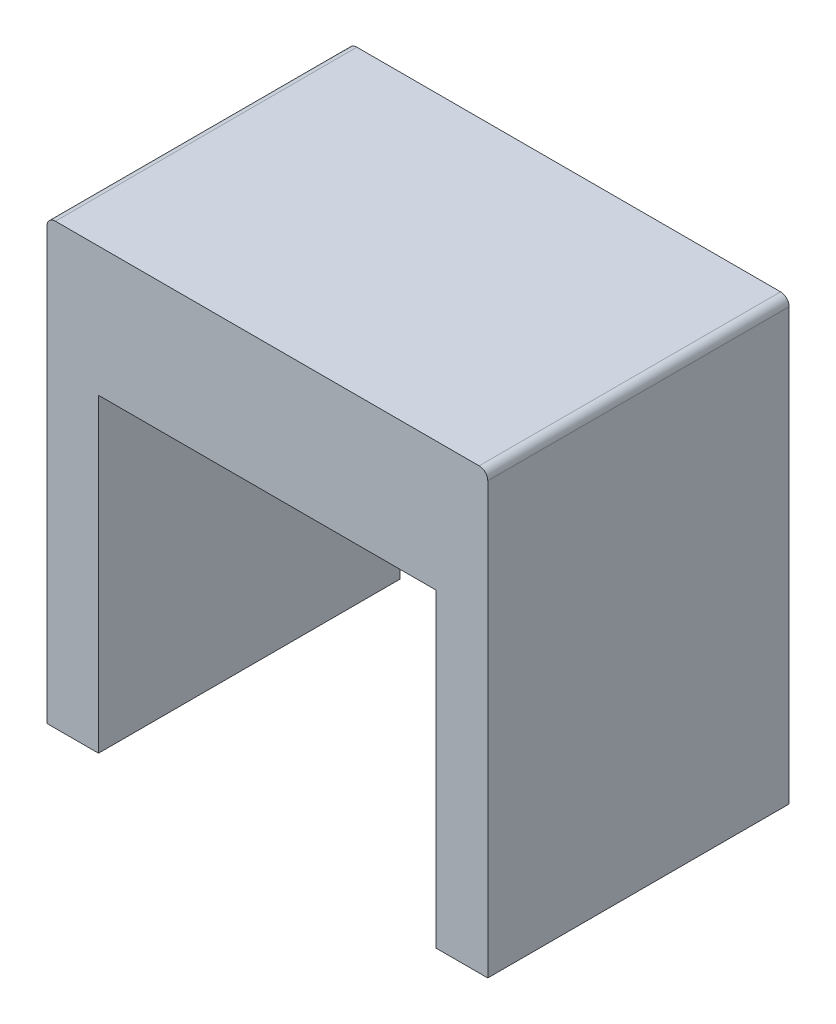
ISO-10303-21;
HEADER;
FILE_DESCRIPTION(('STEP AP214'),'2;1');
FILE_NAME('part.step','',(''),(''),'','','');
FILE_SCHEMA(('AUTOMOTIVE_DESIGN { 1 0 10303 214 1 1 1 1 }'));
ENDSEC;
DATA;
#1=APPLICATION_CONTEXT('core data for automotive mechanical design processes');
#2=APPLICATION_PROTOCOL_DEFINITION('international standard','automotive_design',2000,#1);
#3=PRODUCT_CONTEXT('',#1,'mechanical');
#4=PRODUCT('Part','Part','',(#3));
#5=PRODUCT_RELATED_PRODUCT_CATEGORY('part','',(#4));
#6=PRODUCT_DEFINITION_FORMATION('','',#4);
#7=PRODUCT_DEFINITION_CONTEXT('part definition',#1,'design');
#8=PRODUCT_DEFINITION('design','',#6,#7);
#9=PRODUCT_DEFINITION_SHAPE('','',#8);
#10=(LENGTH_UNIT() NAMED_UNIT(*) SI_UNIT(.MILLI.,.METRE.));
#11=(NAMED_UNIT(*) PLANE_ANGLE_UNIT() SI_UNIT($,.RADIAN.));
#12=(NAMED_UNIT(*) SI_UNIT($,.STERADIAN.) SOLID_ANGLE_UNIT());
#13=UNCERTAINTY_MEASURE_WITH_UNIT(LENGTH_MEASURE(1.E-05),#10,'distance_accuracy_value','');
#14=(GEOMETRIC_REPRESENTATION_CONTEXT(3) GLOBAL_UNCERTAINTY_ASSIGNED_CONTEXT((#13)) GLOBAL_UNIT_ASSIGNED_CONTEXT((#10,
#11,#12)) REPRESENTATION_CONTEXT('',''));
#15=CARTESIAN_POINT('',(0.,0.,0.));
#16=DIRECTION('',(0.,0.,1.));
#17=DIRECTION('',(1.,0.,0.));
#18=AXIS2_PLACEMENT_3D('',#15,#16,#17);
#19=CARTESIAN_POINT('',(-31.340782122905,-40.8812849162013,35.));
#20=DIRECTION('',(0.,1.,0.));
#21=DIRECTION('',(0.,0.,1.));
#22=AXIS2_PLACEMENT_3D('',#19,#20,#21);
#23=PLANE('',#22);
#24=DIRECTION('',(1.,0.,0.));
#25=VECTOR('',#24,1.);
#26=CARTESIAN_POINT('',(-31.340782122905,-40.8812849162013,0.));
#27=LINE('',#26,#25);
#28=CARTESIAN_POINT('',(-31.340782122905,-40.8812849162013,0.));
#29=VERTEX_POINT('',#28);
#30=CARTESIAN_POINT('',(-25.340782122905,-40.8812849162013,0.));
#31=VERTEX_POINT('',#30);
#32=EDGE_CURVE('E134',#29,#31,#27,.T.);
#33=ORIENTED_EDGE('',*,*,#32,.T.);
#34=DIRECTION('',(0.,0.,-1.));
#35=VECTOR('',#34,1.);
#36=CARTESIAN_POINT('',(-25.340782122905,-40.8812849162013,35.));
#37=LINE('',#36,#35);
#38=CARTESIAN_POINT('',(-25.340782122905,-40.8812849162013,35.));
#39=VERTEX_POINT('',#38);
#40=EDGE_CURVE('E117',#39,#31,#37,.T.);
#41=ORIENTED_EDGE('',*,*,#40,.F.);
#42=DIRECTION('',(1.,0.,0.));
#43=VECTOR('',#42,1.);
#44=CARTESIAN_POINT('',(-31.340782122905,-40.8812849162013,35.));
#45=LINE('',#44,#43);
#46=CARTESIAN_POINT('',(-31.340782122905,-40.8812849162013,35.));
#47=VERTEX_POINT('',#46);
#48=EDGE_CURVE('E123',#47,#39,#45,.T.);
#49=ORIENTED_EDGE('',*,*,#48,.F.);
#50=DIRECTION('',(0.,0.,-1.));
#51=VECTOR('',#50,1.);
#52=CARTESIAN_POINT('',(-31.340782122905,-40.8812849162013,35.));
#53=LINE('',#52,#51);
#54=EDGE_CURVE('E181',#47,#29,#53,.T.);
#55=ORIENTED_EDGE('',*,*,#54,.T.);
#56=EDGE_LOOP('',(#33,#41,#49,#55));
#57=FACE_BOUND('',#56,.T.);
#58=ADVANCED_FACE('F33',(#57),#23,.F.);
#59=CARTESIAN_POINT('',(-25.340782122905,-40.8812849162013,35.));
#60=DIRECTION('',(-1.,0.,0.));
#61=DIRECTION('',(0.,0.,1.));
#62=AXIS2_PLACEMENT_3D('',#59,#60,#61);
#63=PLANE('',#62);
#64=DIRECTION('',(0.,1.,0.));
#65=VECTOR('',#64,1.);
#66=CARTESIAN_POINT('',(-25.340782122905,-40.8812849162013,0.));
#67=LINE('',#66,#65);
#68=CARTESIAN_POINT('',(-25.340782122905,-4.8812849162013,0.));
#69=VERTEX_POINT('',#68);
#70=EDGE_CURVE('E197',#31,#69,#67,.T.);
#71=ORIENTED_EDGE('',*,*,#70,.T.);
#72=DIRECTION('',(0.,0.,-1.));
#73=VECTOR('',#72,1.);
#74=CARTESIAN_POINT('',(-25.340782122905,-4.8812849162013,35.));
#75=LINE('',#74,#73);
#76=CARTESIAN_POINT('',(-25.340782122905,-4.8812849162013,35.));
#77=VERTEX_POINT('',#76);
#78=EDGE_CURVE('E120',#77,#69,#75,.T.);
#79=ORIENTED_EDGE('',*,*,#78,.F.);
#80=DIRECTION('',(0.,1.,0.));
#81=VECTOR('',#80,1.);
#82=CARTESIAN_POINT('',(-25.340782122905,-40.8812849162013,35.));
#83=LINE('',#82,#81);
#84=EDGE_CURVE('E113',#39,#77,#83,.T.);
#85=ORIENTED_EDGE('',*,*,#84,.F.);
#86=ORIENTED_EDGE('',*,*,#40,.T.);
#87=EDGE_LOOP('',(#71,#79,#85,#86));
#88=FACE_BOUND('',#87,.T.);
#89=ADVANCED_FACE('F115',(#88),#63,.F.);
#90=CARTESIAN_POINT('',(-25.340782122905,-4.8812849162013,35.));
#91=DIRECTION('',(0.,1.,0.));
#92=DIRECTION('',(0.,0.,1.));
#93=AXIS2_PLACEMENT_3D('',#90,#91,#92);
#94=PLANE('',#93);
#95=DIRECTION('',(1.,0.,0.));
#96=VECTOR('',#95,1.);
#97=CARTESIAN_POINT('',(-25.340782122905,-4.8812849162013,0.));
#98=LINE('',#97,#96);
#99=CARTESIAN_POINT('',(13.859217877095,-4.8812849162013,0.));
#100=VERTEX_POINT('',#99);
#101=EDGE_CURVE('E196',#69,#100,#98,.T.);
#102=ORIENTED_EDGE('',*,*,#101,.T.);
#103=DIRECTION('',(0.,0.,-1.));
#104=VECTOR('',#103,1.);
#105=CARTESIAN_POINT('',(13.859217877095,-4.8812849162013,35.));
#106=LINE('',#105,#104);
#107=CARTESIAN_POINT('',(13.859217877095,-4.8812849162013,35.));
#108=VERTEX_POINT('',#107);
#109=EDGE_CURVE('E139',#108,#100,#106,.T.);
#110=ORIENTED_EDGE('',*,*,#109,.F.);
#111=DIRECTION('',(1.,0.,0.));
#112=VECTOR('',#111,1.);
#113=CARTESIAN_POINT('',(-25.340782122905,-4.8812849162013,35.));
#114=LINE('',#113,#112);
#115=EDGE_CURVE('E122',#77,#108,#114,.T.);
#116=ORIENTED_EDGE('',*,*,#115,.F.);
#117=ORIENTED_EDGE('',*,*,#78,.T.);
#118=EDGE_LOOP('',(#102,#110,#116,#117));
#119=FACE_BOUND('',#118,.T.);
#120=ADVANCED_FACE('F207',(#119),#94,.F.);
#121=CARTESIAN_POINT('',(13.859217877095,-4.8812849162013,35.));
#122=DIRECTION('',(1.,0.,0.));
#123=DIRECTION('',(0.,1.,0.));
#124=AXIS2_PLACEMENT_3D('',#121,#122,#123);
#125=PLANE('',#124);
#126=DIRECTION('',(0.,-1.,0.));
#127=VECTOR('',#126,1.);
#128=CARTESIAN_POINT('',(13.859217877095,-4.8812849162013,0.));
#129=LINE('',#128,#127);
#130=CARTESIAN_POINT('',(13.859217877095,-40.8812849162013,0.));
#131=VERTEX_POINT('',#130);
#132=EDGE_CURVE('E176',#100,#131,#129,.T.);
#133=ORIENTED_EDGE('',*,*,#132,.T.);
#134=DIRECTION('',(0.,0.,-1.));
#135=VECTOR('',#134,1.);
#136=CARTESIAN_POINT('',(13.859217877095,-40.8812849162013,35.));
#137=LINE('',#136,#135);
#138=CARTESIAN_POINT('',(13.859217877095,-40.8812849162013,35.));
#139=VERTEX_POINT('',#138);
#140=EDGE_CURVE('E184',#139,#131,#137,.T.);
#141=ORIENTED_EDGE('',*,*,#140,.F.);
#142=DIRECTION('',(0.,-1.,0.));
#143=VECTOR('',#142,1.);
#144=CARTESIAN_POINT('',(13.859217877095,-4.8812849162013,35.));
#145=LINE('',#144,#143);
#146=EDGE_CURVE('E193',#108,#139,#145,.T.);
#147=ORIENTED_EDGE('',*,*,#146,.F.);
#148=ORIENTED_EDGE('',*,*,#109,.T.);
#149=EDGE_LOOP('',(#133,#141,#147,#148));
#150=FACE_BOUND('',#149,.T.);
#151=ADVANCED_FACE('F191',(#150),#125,.F.);
#152=CARTESIAN_POINT('',(13.859217877095,-40.8812849162013,35.));
#153=DIRECTION('',(0.,1.,0.));
#154=DIRECTION('',(0.,0.,1.));
#155=AXIS2_PLACEMENT_3D('',#152,#153,#154);
#156=PLANE('',#155);
#157=DIRECTION('',(1.,0.,0.));
#158=VECTOR('',#157,1.);
#159=CARTESIAN_POINT('',(13.859217877095,-40.8812849162013,0.));
#160=LINE('',#159,#158);
#161=CARTESIAN_POINT('',(19.859217877095,-40.8812849162013,0.));
#162=VERTEX_POINT('',#161);
#163=EDGE_CURVE('E173',#131,#162,#160,.T.);
#164=ORIENTED_EDGE('',*,*,#163,.T.);
#165=DIRECTION('',(0.,0.,-1.));
#166=VECTOR('',#165,1.);
#167=CARTESIAN_POINT('',(19.859217877095,-40.8812849162013,35.));
#168=LINE('',#167,#166);
#169=CARTESIAN_POINT('',(19.859217877095,-40.8812849162013,35.));
#170=VERTEX_POINT('',#169);
#171=EDGE_CURVE('E172',#170,#162,#168,.T.);
#172=ORIENTED_EDGE('',*,*,#171,.F.);
#173=DIRECTION('',(1.,0.,0.));
#174=VECTOR('',#173,1.);
#175=CARTESIAN_POINT('',(13.859217877095,-40.8812849162013,35.));
#176=LINE('',#175,#174);
#177=EDGE_CURVE('E204',#139,#170,#176,.T.);
#178=ORIENTED_EDGE('',*,*,#177,.F.);
#179=ORIENTED_EDGE('',*,*,#140,.T.);
#180=EDGE_LOOP('',(#164,#172,#178,#179));
#181=FACE_BOUND('',#180,.T.);
#182=ADVANCED_FACE('F214',(#181),#156,.F.);
#183=CARTESIAN_POINT('',(19.859217877095,-40.8812849162013,35.));
#184=DIRECTION('',(-1.,0.,0.));
#185=DIRECTION('',(0.,0.,1.));
#186=AXIS2_PLACEMENT_3D('',#183,#184,#185);
#187=PLANE('',#186);
#188=DIRECTION('',(0.,1.,0.));
#189=VECTOR('',#188,1.);
#190=CARTESIAN_POINT('',(19.859217877095,-40.8812849162013,0.));
#191=LINE('',#190,#189);
#192=CARTESIAN_POINT('',(19.859217877095,9.1187150837987,0.));
#193=VERTEX_POINT('',#192);
#194=EDGE_CURVE('E167',#162,#193,#191,.T.);
#195=ORIENTED_EDGE('',*,*,#194,.T.);
#196=DIRECTION('',(0.,0.,-1.));
#197=VECTOR('',#196,1.);
#198=CARTESIAN_POINT('',(19.859217877095,9.1187150837987,35.));
#199=LINE('',#198,#197);
#200=CARTESIAN_POINT('',(19.859217877095,9.1187150837987,35.));
#201=VERTEX_POINT('',#200);
#202=EDGE_CURVE('E56',#193,#201,#199,.F.);
#203=ORIENTED_EDGE('',*,*,#202,.T.);
#204=DIRECTION('',(0.,1.,0.));
#205=VECTOR('',#204,1.);
#206=CARTESIAN_POINT('',(19.859217877095,-40.8812849162013,35.));
#207=LINE('',#206,#205);
#208=EDGE_CURVE('E153',#170,#201,#207,.T.);
#209=ORIENTED_EDGE('',*,*,#208,.F.);
#210=ORIENTED_EDGE('',*,*,#171,.T.);
#211=EDGE_LOOP('',(#195,#203,#209,#210));
#212=FACE_BOUND('',#211,.T.);
#213=ADVANCED_FACE('F170',(#212),#187,.F.);
#214=CARTESIAN_POINT('',(19.859217877095,10.1187150837987,35.));
#215=DIRECTION('',(0.,-1.,0.));
#216=DIRECTION('',(0.,0.,-1.));
#217=AXIS2_PLACEMENT_3D('',#214,#215,#216);
#218=PLANE('',#217);
#219=DIRECTION('',(-1.,0.,0.));
#220=VECTOR('',#219,1.);
#221=CARTESIAN_POINT('',(19.859217877095,10.1187150837987,35.));
#222=LINE('',#221,#220);
#223=CARTESIAN_POINT('',(18.859217877095,10.1187150837987,35.));
#224=VERTEX_POINT('',#223);
#225=CARTESIAN_POINT('',(-30.340782122905,10.1187150837987,35.));
#226=VERTEX_POINT('',#225);
#227=EDGE_CURVE('E152',#224,#226,#222,.T.);
#228=ORIENTED_EDGE('',*,*,#227,.F.);
#229=DIRECTION('',(0.,0.,-1.));
#230=VECTOR('',#229,1.);
#231=CARTESIAN_POINT('',(18.859217877095,10.1187150837987,35.));
#232=LINE('',#231,#230);
#233=CARTESIAN_POINT('',(18.859217877095,10.1187150837987,0.));
#234=VERTEX_POINT('',#233);
#235=EDGE_CURVE('E137',#224,#234,#232,.T.);
#236=ORIENTED_EDGE('',*,*,#235,.T.);
#237=DIRECTION('',(-1.,0.,0.));
#238=VECTOR('',#237,1.);
#239=CARTESIAN_POINT('',(19.859217877095,10.1187150837987,0.));
#240=LINE('',#239,#238);
#241=CARTESIAN_POINT('',(-30.340782122905,10.1187150837987,0.));
#242=VERTEX_POINT('',#241);
#243=EDGE_CURVE('E168',#234,#242,#240,.T.);
#244=ORIENTED_EDGE('',*,*,#243,.T.);
#245=DIRECTION('',(0.,0.,-1.));
#246=VECTOR('',#245,1.);
#247=CARTESIAN_POINT('',(-30.340782122905,10.1187150837987,35.));
#248=LINE('',#247,#246);
#249=EDGE_CURVE('E135',#242,#226,#248,.F.);
#250=ORIENTED_EDGE('',*,*,#249,.T.);
#251=EDGE_LOOP('',(#228,#236,#244,#250));
#252=FACE_BOUND('',#251,.T.);
#253=ADVANCED_FACE('F157',(#252),#218,.F.);
#254=CARTESIAN_POINT('',(-31.340782122905,10.1187150837987,35.));
#255=DIRECTION('',(1.,0.,0.));
#256=DIRECTION('',(0.,0.,-1.));
#257=AXIS2_PLACEMENT_3D('',#254,#255,#256);
#258=PLANE('',#257);
#259=DIRECTION('',(0.,-1.,0.));
#260=VECTOR('',#259,1.);
#261=CARTESIAN_POINT('',(-31.340782122905,10.1187150837987,35.));
#262=LINE('',#261,#260);
#263=CARTESIAN_POINT('',(-31.340782122905,9.1187150837987,35.));
#264=VERTEX_POINT('',#263);
#265=EDGE_CURVE('E127',#264,#47,#262,.T.);
#266=ORIENTED_EDGE('',*,*,#265,.F.);
#267=DIRECTION('',(0.,0.,-1.));
#268=VECTOR('',#267,1.);
#269=CARTESIAN_POINT('',(-31.340782122905,9.1187150837987,35.));
#270=LINE('',#269,#268);
#271=CARTESIAN_POINT('',(-31.340782122905,9.1187150837987,0.));
#272=VERTEX_POINT('',#271);
#273=EDGE_CURVE('E11',#264,#272,#270,.T.);
#274=ORIENTED_EDGE('',*,*,#273,.T.);
#275=DIRECTION('',(0.,-1.,0.));
#276=VECTOR('',#275,1.);
#277=CARTESIAN_POINT('',(-31.340782122905,10.1187150837987,0.));
#278=LINE('',#277,#276);
#279=EDGE_CURVE('E131',#272,#29,#278,.T.);
#280=ORIENTED_EDGE('',*,*,#279,.T.);
#281=ORIENTED_EDGE('',*,*,#54,.F.);
#282=EDGE_LOOP('',(#266,#274,#280,#281));
#283=FACE_BOUND('',#282,.T.);
#284=ADVANCED_FACE('F231',(#283),#258,.F.);
#285=CARTESIAN_POINT('',(0.,0.,35.));
#286=DIRECTION('',(0.,0.,1.));
#287=DIRECTION('',(1.,0.,0.));
#288=AXIS2_PLACEMENT_3D('',#285,#286,#287);
#289=PLANE('',#288);
#290=ORIENTED_EDGE('',*,*,#208,.T.);
#291=CARTESIAN_POINT('',(18.859217877095,9.1187150837987,35.));
#292=DIRECTION('',(0.,0.,1.));
#293=DIRECTION('',(1.,0.,0.));
#294=AXIS2_PLACEMENT_3D('',#291,#292,#293);
#295=CIRCLE('',#294,1.);
#296=EDGE_CURVE('E41',#201,#224,#295,.T.);
#297=ORIENTED_EDGE('',*,*,#296,.T.);
#298=ORIENTED_EDGE('',*,*,#227,.T.);
#299=CARTESIAN_POINT('',(-30.340782122905,9.1187150837987,35.));
#300=DIRECTION('',(0.,0.,1.));
#301=DIRECTION('',(1.,0.,0.));
#302=AXIS2_PLACEMENT_3D('',#299,#300,#301);
#303=CIRCLE('',#302,1.);
#304=EDGE_CURVE('E48',#226,#264,#303,.T.);
#305=ORIENTED_EDGE('',*,*,#304,.T.);
#306=ORIENTED_EDGE('',*,*,#265,.T.);
#307=ORIENTED_EDGE('',*,*,#48,.T.);
#308=ORIENTED_EDGE('',*,*,#84,.T.);
#309=ORIENTED_EDGE('',*,*,#115,.T.);
#310=ORIENTED_EDGE('',*,*,#146,.T.);
#311=ORIENTED_EDGE('',*,*,#177,.T.);
#312=EDGE_LOOP('',(#290,#297,#298,#305,#306,#307,#308,#309,#310,#311));
#313=FACE_BOUND('',#312,.T.);
#314=ADVANCED_FACE('F126',(#313),#289,.T.);
#315=CARTESIAN_POINT('',(0.,0.,0.));
#316=DIRECTION('',(0.,0.,1.));
#317=DIRECTION('',(1.,0.,0.));
#318=AXIS2_PLACEMENT_3D('',#315,#316,#317);
#319=PLANE('',#318);
#320=ORIENTED_EDGE('',*,*,#243,.F.);
#321=CARTESIAN_POINT('',(18.859217877095,9.1187150837987,0.));
#322=DIRECTION('',(0.,0.,1.));
#323=DIRECTION('',(1.,0.,0.));
#324=AXIS2_PLACEMENT_3D('',#321,#322,#323);
#325=CIRCLE('',#324,1.);
#326=EDGE_CURVE('E147',#234,#193,#325,.F.);
#327=ORIENTED_EDGE('',*,*,#326,.T.);
#328=ORIENTED_EDGE('',*,*,#194,.F.);
#329=ORIENTED_EDGE('',*,*,#163,.F.);
#330=ORIENTED_EDGE('',*,*,#132,.F.);
#331=ORIENTED_EDGE('',*,*,#101,.F.);
#332=ORIENTED_EDGE('',*,*,#70,.F.);
#333=ORIENTED_EDGE('',*,*,#32,.F.);
#334=ORIENTED_EDGE('',*,*,#279,.F.);
#335=CARTESIAN_POINT('',(-30.340782122905,9.1187150837987,0.));
#336=DIRECTION('',(0.,0.,1.));
#337=DIRECTION('',(1.,0.,0.));
#338=AXIS2_PLACEMENT_3D('',#335,#336,#337);
#339=CIRCLE('',#338,1.);
#340=EDGE_CURVE('E145',#272,#242,#339,.F.);
#341=ORIENTED_EDGE('',*,*,#340,.T.);
#342=EDGE_LOOP('',(#320,#327,#328,#329,#330,#331,#332,#333,#334,#341));
#343=FACE_BOUND('',#342,.T.);
#344=ADVANCED_FACE('F165',(#343),#319,.F.);
#345=CARTESIAN_POINT('',(18.859217877095,9.1187150837987,35.));
#346=DIRECTION('',(0.,0.,-1.));
#347=DIRECTION('',(-1.,0.,0.));
#348=AXIS2_PLACEMENT_3D('',#345,#346,#347);
#349=CYLINDRICAL_SURFACE('',#348,1.);
#350=ORIENTED_EDGE('',*,*,#296,.F.);
#351=ORIENTED_EDGE('',*,*,#202,.F.);
#352=ORIENTED_EDGE('',*,*,#326,.F.);
#353=ORIENTED_EDGE('',*,*,#235,.F.);
#354=EDGE_LOOP('',(#350,#351,#352,#353));
#355=FACE_BOUND('',#354,.T.);
#356=ADVANCED_FACE('F162',(#355),#349,.T.);
#357=CARTESIAN_POINT('',(-30.340782122905,9.1187150837987,35.));
#358=DIRECTION('',(0.,0.,-1.));
#359=DIRECTION('',(-1.,0.,0.));
#360=AXIS2_PLACEMENT_3D('',#357,#358,#359);
#361=CYLINDRICAL_SURFACE('',#360,1.);
#362=ORIENTED_EDGE('',*,*,#304,.F.);
#363=ORIENTED_EDGE('',*,*,#249,.F.);
#364=ORIENTED_EDGE('',*,*,#340,.F.);
#365=ORIENTED_EDGE('',*,*,#273,.F.);
#366=EDGE_LOOP('',(#362,#363,#364,#365));
#367=FACE_BOUND('',#366,.T.);
#368=ADVANCED_FACE('F35',(#367),#361,.T.);
#369=CLOSED_SHELL('',(#58,#89,#120,#151,#182,#213,#253,#284,#314,#344,#356,#368));
#370=MANIFOLD_SOLID_BREP('B2',#369);
#371=ADVANCED_BREP_SHAPE_REPRESENTATION('',(#18,#370),#14);
#372=SHAPE_DEFINITION_REPRESENTATION(#9,#371);
ENDSEC;
END-ISO-10303-21;
